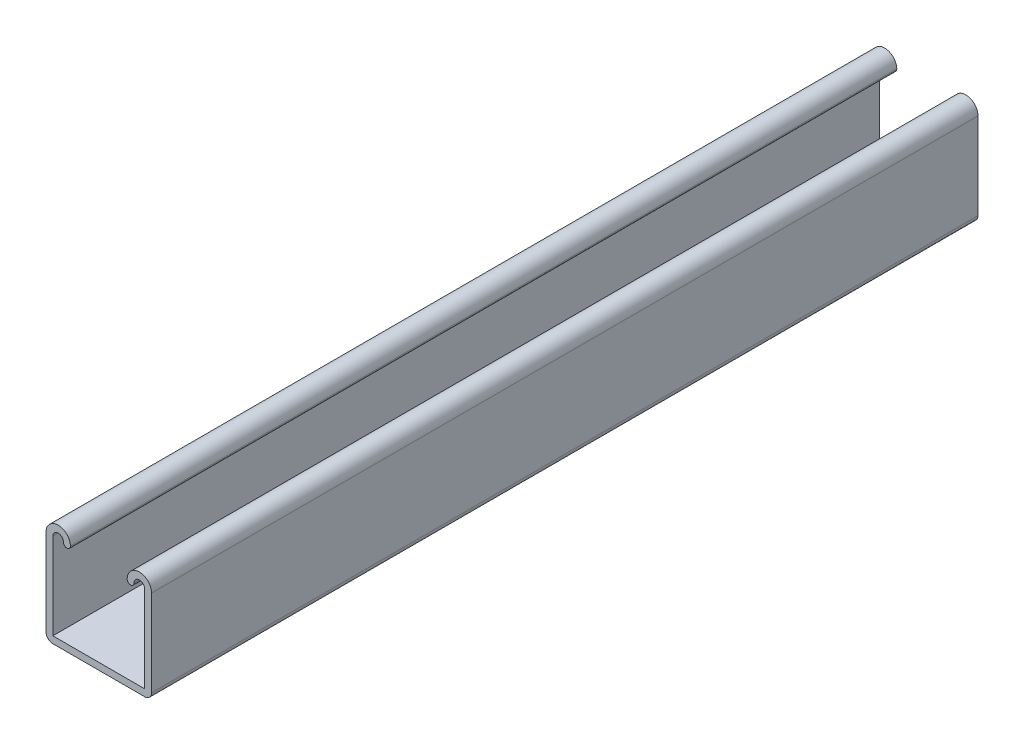
ISO-10303-21;
HEADER;
FILE_DESCRIPTION(('STEP AP214'),'2;1');
FILE_NAME('part.step','',(''),(''),'','','');
FILE_SCHEMA(('AUTOMOTIVE_DESIGN { 1 0 10303 214 1 1 1 1 }'));
ENDSEC;
DATA;
#1=APPLICATION_CONTEXT('core data for automotive mechanical design processes');
#2=APPLICATION_PROTOCOL_DEFINITION('international standard','automotive_design',2000,#1);
#3=PRODUCT_CONTEXT('',#1,'mechanical');
#4=PRODUCT('Part','Part','',(#3));
#5=PRODUCT_RELATED_PRODUCT_CATEGORY('part','',(#4));
#6=PRODUCT_DEFINITION_FORMATION('','',#4);
#7=PRODUCT_DEFINITION_CONTEXT('part definition',#1,'design');
#8=PRODUCT_DEFINITION('design','',#6,#7);
#9=PRODUCT_DEFINITION_SHAPE('','',#8);
#10=(LENGTH_UNIT() NAMED_UNIT(*) SI_UNIT(.MILLI.,.METRE.));
#11=(NAMED_UNIT(*) PLANE_ANGLE_UNIT() SI_UNIT($,.RADIAN.));
#12=(NAMED_UNIT(*) SI_UNIT($,.STERADIAN.) SOLID_ANGLE_UNIT());
#13=UNCERTAINTY_MEASURE_WITH_UNIT(LENGTH_MEASURE(1.E-05),#10,'distance_accuracy_value','');
#14=(GEOMETRIC_REPRESENTATION_CONTEXT(3) GLOBAL_UNCERTAINTY_ASSIGNED_CONTEXT((#13)) GLOBAL_UNIT_ASSIGNED_CONTEXT((#10,
#11,#12)) REPRESENTATION_CONTEXT('',''));
#15=CARTESIAN_POINT('',(0.,0.,0.));
#16=DIRECTION('',(0.,0.,1.));
#17=DIRECTION('',(1.,0.,0.));
#18=AXIS2_PLACEMENT_3D('',#15,#16,#17);
#19=CARTESIAN_POINT('',(0.,2.6924,323.85));
#20=DIRECTION('',(0.,0.,-1.));
#21=DIRECTION('',(-1.,0.,0.));
#22=AXIS2_PLACEMENT_3D('',#19,#20,#21);
#23=CYLINDRICAL_SURFACE('',#22,2.6924);
#24=CARTESIAN_POINT('',(0.,2.6924,0.));
#25=DIRECTION('',(0.,0.,1.));
#26=DIRECTION('',(-1.,0.,0.));
#27=AXIS2_PLACEMENT_3D('',#24,#25,#26);
#28=CIRCLE('',#27,2.6924);
#29=CARTESIAN_POINT('',(-2.6924,2.6924,0.));
#30=VERTEX_POINT('',#29);
#31=CARTESIAN_POINT('',(0.,0.,0.));
#32=VERTEX_POINT('',#31);
#33=EDGE_CURVE('E166',#30,#32,#28,.T.);
#34=ORIENTED_EDGE('',*,*,#33,.T.);
#35=DIRECTION('',(0.,0.,-1.));
#36=VECTOR('',#35,1.);
#37=CARTESIAN_POINT('',(0.,0.,323.85));
#38=LINE('',#37,#36);
#39=CARTESIAN_POINT('',(0.,0.,323.85));
#40=VERTEX_POINT('',#39);
#41=EDGE_CURVE('E11',#40,#32,#38,.T.);
#42=ORIENTED_EDGE('',*,*,#41,.F.);
#43=CARTESIAN_POINT('',(0.,2.6924,323.85));
#44=DIRECTION('',(0.,0.,1.));
#45=DIRECTION('',(-1.,0.,0.));
#46=AXIS2_PLACEMENT_3D('',#43,#44,#45);
#47=CIRCLE('',#46,2.6924);
#48=CARTESIAN_POINT('',(-2.6924,2.6924,323.85));
#49=VERTEX_POINT('',#48);
#50=EDGE_CURVE('E193',#49,#40,#47,.T.);
#51=ORIENTED_EDGE('',*,*,#50,.F.);
#52=DIRECTION('',(0.,0.,-1.));
#53=VECTOR('',#52,1.);
#54=CARTESIAN_POINT('',(-2.6924,2.6924,323.85));
#55=LINE('',#54,#53);
#56=EDGE_CURVE('E162',#49,#30,#55,.T.);
#57=ORIENTED_EDGE('',*,*,#56,.T.);
#58=EDGE_LOOP('',(#34,#42,#51,#57));
#59=FACE_BOUND('',#58,.T.);
#60=ADVANCED_FACE('F32',(#59),#23,.T.);
#61=CARTESIAN_POINT('',(0.,0.,323.85));
#62=DIRECTION('',(0.,1.,0.));
#63=DIRECTION('',(0.,0.,1.));
#64=AXIS2_PLACEMENT_3D('',#61,#62,#63);
#65=PLANE('',#64);
#66=CARTESIAN_POINT('',(17.99,0.,247.65));
#67=DIRECTION('',(0.,-1.,0.));
#68=DIRECTION('',(0.,0.,1.));
#69=AXIS2_PLACEMENT_3D('',#66,#67,#68);
#70=CIRCLE('',#69,7.11200000000001);
#71=CARTESIAN_POINT('',(17.99,0.,254.762));
#72=VERTEX_POINT('',#71);
#73=EDGE_CURVE('E241',#72,#72,#70,.T.);
#74=ORIENTED_EDGE('',*,*,#73,.F.);
#75=EDGE_LOOP('',(#74));
#76=FACE_BOUND('',#75,.T.);
#77=CARTESIAN_POINT('',(17.99,0.,295.402));
#78=DIRECTION('',(0.,-1.,0.));
#79=DIRECTION('',(0.,0.,1.));
#80=AXIS2_PLACEMENT_3D('',#77,#78,#79);
#81=CIRCLE('',#80,7.11199999999999);
#82=CARTESIAN_POINT('',(17.99,0.,302.514));
#83=VERTEX_POINT('',#82);
#84=EDGE_CURVE('E231',#83,#83,#81,.T.);
#85=ORIENTED_EDGE('',*,*,#84,.F.);
#86=EDGE_LOOP('',(#85));
#87=FACE_BOUND('',#86,.T.);
#88=CARTESIAN_POINT('',(17.99,0.,76.2));
#89=DIRECTION('',(0.,-1.,0.));
#90=DIRECTION('',(0.,0.,-1.));
#91=AXIS2_PLACEMENT_3D('',#88,#89,#90);
#92=CIRCLE('',#91,7.112);
#93=CARTESIAN_POINT('',(17.99,0.,69.088));
#94=VERTEX_POINT('',#93);
#95=EDGE_CURVE('E228',#94,#94,#92,.T.);
#96=ORIENTED_EDGE('',*,*,#95,.F.);
#97=EDGE_LOOP('',(#96));
#98=FACE_BOUND('',#97,.T.);
#99=CARTESIAN_POINT('',(17.99,0.,28.448));
#100=DIRECTION('',(0.,-1.,0.));
#101=DIRECTION('',(0.,0.,-1.));
#102=AXIS2_PLACEMENT_3D('',#99,#100,#101);
#103=CIRCLE('',#102,7.112);
#104=CARTESIAN_POINT('',(17.99,0.,21.336));
#105=VERTEX_POINT('',#104);
#106=EDGE_CURVE('E225',#105,#105,#103,.T.);
#107=ORIENTED_EDGE('',*,*,#106,.F.);
#108=EDGE_LOOP('',(#107));
#109=FACE_BOUND('',#108,.T.);
#110=DIRECTION('',(1.,0.,0.));
#111=VECTOR('',#110,1.);
#112=CARTESIAN_POINT('',(0.,0.,0.));
#113=LINE('',#112,#111);
#114=CARTESIAN_POINT('',(35.98,0.,0.));
#115=VERTEX_POINT('',#114);
#116=EDGE_CURVE('E169',#32,#115,#113,.T.);
#117=ORIENTED_EDGE('',*,*,#116,.T.);
#118=DIRECTION('',(0.,0.,-1.));
#119=VECTOR('',#118,1.);
#120=CARTESIAN_POINT('',(35.98,0.,323.85));
#121=LINE('',#120,#119);
#122=CARTESIAN_POINT('',(35.98,0.,323.85));
#123=VERTEX_POINT('',#122);
#124=EDGE_CURVE('E41',#123,#115,#121,.T.);
#125=ORIENTED_EDGE('',*,*,#124,.F.);
#126=DIRECTION('',(1.,0.,0.));
#127=VECTOR('',#126,1.);
#128=CARTESIAN_POINT('',(0.,0.,323.85));
#129=LINE('',#128,#127);
#130=EDGE_CURVE('E111',#40,#123,#129,.T.);
#131=ORIENTED_EDGE('',*,*,#130,.F.);
#132=ORIENTED_EDGE('',*,*,#41,.T.);
#133=EDGE_LOOP('',(#117,#125,#131,#132));
#134=FACE_BOUND('',#133,.T.);
#135=ADVANCED_FACE('F291',(#76,#87,#98,#109,#134),#65,.F.);
#136=CARTESIAN_POINT('',(35.98,2.6924,323.85));
#137=DIRECTION('',(0.,0.,-1.));
#138=DIRECTION('',(-1.,0.,0.));
#139=AXIS2_PLACEMENT_3D('',#136,#137,#138);
#140=CYLINDRICAL_SURFACE('',#139,2.6924);
#141=CARTESIAN_POINT('',(35.98,2.6924,0.));
#142=DIRECTION('',(0.,0.,1.));
#143=DIRECTION('',(1.,0.,0.));
#144=AXIS2_PLACEMENT_3D('',#141,#142,#143);
#145=CIRCLE('',#144,2.6924);
#146=CARTESIAN_POINT('',(38.6724,2.6924,0.));
#147=VERTEX_POINT('',#146);
#148=EDGE_CURVE('E172',#115,#147,#145,.T.);
#149=ORIENTED_EDGE('',*,*,#148,.T.);
#150=DIRECTION('',(0.,0.,-1.));
#151=VECTOR('',#150,1.);
#152=CARTESIAN_POINT('',(38.6724,2.6924,323.85));
#153=LINE('',#152,#151);
#154=CARTESIAN_POINT('',(38.6724,2.6924,323.85));
#155=VERTEX_POINT('',#154);
#156=EDGE_CURVE('E218',#155,#147,#153,.T.);
#157=ORIENTED_EDGE('',*,*,#156,.F.);
#158=CARTESIAN_POINT('',(35.98,2.6924,323.85));
#159=DIRECTION('',(0.,0.,1.));
#160=DIRECTION('',(1.,0.,0.));
#161=AXIS2_PLACEMENT_3D('',#158,#159,#160);
#162=CIRCLE('',#161,2.6924);
#163=EDGE_CURVE('E248',#123,#155,#162,.T.);
#164=ORIENTED_EDGE('',*,*,#163,.F.);
#165=ORIENTED_EDGE('',*,*,#124,.T.);
#166=EDGE_LOOP('',(#149,#157,#164,#165));
#167=FACE_BOUND('',#166,.T.);
#168=ADVANCED_FACE('F295',(#167),#140,.T.);
#169=CARTESIAN_POINT('',(38.6724,2.6924,323.85));
#170=DIRECTION('',(-1.,0.,0.));
#171=DIRECTION('',(0.,0.,1.));
#172=AXIS2_PLACEMENT_3D('',#169,#170,#171);
#173=PLANE('',#172);
#174=DIRECTION('',(0.,1.,0.));
#175=VECTOR('',#174,1.);
#176=CARTESIAN_POINT('',(38.6724,2.6924,0.));
#177=LINE('',#176,#175);
#178=CARTESIAN_POINT('',(38.6724,36.5252,0.));
#179=VERTEX_POINT('',#178);
#180=EDGE_CURVE('E174',#147,#179,#177,.T.);
#181=ORIENTED_EDGE('',*,*,#180,.T.);
#182=DIRECTION('',(0.,0.,-1.));
#183=VECTOR('',#182,1.);
#184=CARTESIAN_POINT('',(38.6724,36.5252,323.85));
#185=LINE('',#184,#183);
#186=CARTESIAN_POINT('',(38.6724,36.5252,323.85));
#187=VERTEX_POINT('',#186);
#188=EDGE_CURVE('E215',#187,#179,#185,.T.);
#189=ORIENTED_EDGE('',*,*,#188,.F.);
#190=DIRECTION('',(0.,1.,0.));
#191=VECTOR('',#190,1.);
#192=CARTESIAN_POINT('',(38.6724,2.6924,323.85));
#193=LINE('',#192,#191);
#194=EDGE_CURVE('E250',#155,#187,#193,.T.);
#195=ORIENTED_EDGE('',*,*,#194,.F.);
#196=ORIENTED_EDGE('',*,*,#156,.T.);
#197=EDGE_LOOP('',(#181,#189,#195,#196));
#198=FACE_BOUND('',#197,.T.);
#199=ADVANCED_FACE('F300',(#198),#173,.F.);
#200=CARTESIAN_POINT('',(33.8972,36.5252,323.85));
#201=DIRECTION('',(0.,0.,-1.));
#202=DIRECTION('',(-1.,0.,0.));
#203=AXIS2_PLACEMENT_3D('',#200,#201,#202);
#204=CYLINDRICAL_SURFACE('',#203,4.7752);
#205=CARTESIAN_POINT('',(33.8972,36.5252,0.));
#206=DIRECTION('',(0.,0.,1.));
#207=DIRECTION('',(1.,0.,0.));
#208=AXIS2_PLACEMENT_3D('',#205,#206,#207);
#209=CIRCLE('',#208,4.7752);
#210=CARTESIAN_POINT('',(29.122,36.5252,0.));
#211=VERTEX_POINT('',#210);
#212=EDGE_CURVE('E176',#179,#211,#209,.T.);
#213=ORIENTED_EDGE('',*,*,#212,.T.);
#214=DIRECTION('',(0.,0.,-1.));
#215=VECTOR('',#214,1.);
#216=CARTESIAN_POINT('',(29.122,36.5252,323.85));
#217=LINE('',#216,#215);
#218=CARTESIAN_POINT('',(29.122,36.5252,323.85));
#219=VERTEX_POINT('',#218);
#220=EDGE_CURVE('E212',#219,#211,#217,.T.);
#221=ORIENTED_EDGE('',*,*,#220,.F.);
#222=CARTESIAN_POINT('',(33.8972,36.5252,323.85));
#223=DIRECTION('',(0.,0.,1.));
#224=DIRECTION('',(1.,0.,0.));
#225=AXIS2_PLACEMENT_3D('',#222,#223,#224);
#226=CIRCLE('',#225,4.7752);
#227=EDGE_CURVE('E252',#187,#219,#226,.T.);
#228=ORIENTED_EDGE('',*,*,#227,.F.);
#229=ORIENTED_EDGE('',*,*,#188,.T.);
#230=EDGE_LOOP('',(#213,#221,#228,#229));
#231=FACE_BOUND('',#230,.T.);
#232=ADVANCED_FACE('F308',(#231),#204,.T.);
#233=CARTESIAN_POINT('',(30.4682,36.5252,323.85));
#234=DIRECTION('',(0.,0.,-1.));
#235=DIRECTION('',(-1.,0.,0.));
#236=AXIS2_PLACEMENT_3D('',#233,#234,#235);
#237=CYLINDRICAL_SURFACE('',#236,1.3462);
#238=CARTESIAN_POINT('',(30.4682,36.5252,0.));
#239=DIRECTION('',(0.,0.,1.));
#240=DIRECTION('',(1.,0.,0.));
#241=AXIS2_PLACEMENT_3D('',#238,#239,#240);
#242=CIRCLE('',#241,1.3462);
#243=CARTESIAN_POINT('',(31.8144,36.5252,0.));
#244=VERTEX_POINT('',#243);
#245=EDGE_CURVE('E178',#211,#244,#242,.T.);
#246=ORIENTED_EDGE('',*,*,#245,.T.);
#247=DIRECTION('',(0.,0.,-1.));
#248=VECTOR('',#247,1.);
#249=CARTESIAN_POINT('',(31.8144,36.5252,323.85));
#250=LINE('',#249,#248);
#251=CARTESIAN_POINT('',(31.8144,36.5252,323.85));
#252=VERTEX_POINT('',#251);
#253=EDGE_CURVE('E209',#252,#244,#250,.T.);
#254=ORIENTED_EDGE('',*,*,#253,.F.);
#255=CARTESIAN_POINT('',(30.4682,36.5252,323.85));
#256=DIRECTION('',(0.,0.,1.));
#257=DIRECTION('',(1.,0.,0.));
#258=AXIS2_PLACEMENT_3D('',#255,#256,#257);
#259=CIRCLE('',#258,1.3462);
#260=EDGE_CURVE('E254',#219,#252,#259,.T.);
#261=ORIENTED_EDGE('',*,*,#260,.F.);
#262=ORIENTED_EDGE('',*,*,#220,.T.);
#263=EDGE_LOOP('',(#246,#254,#261,#262));
#264=FACE_BOUND('',#263,.T.);
#265=ADVANCED_FACE('F312',(#264),#237,.T.);
#266=CARTESIAN_POINT('',(33.8972,36.5252,323.85));
#267=DIRECTION('',(0.,0.,-1.));
#268=DIRECTION('',(-1.,0.,0.));
#269=AXIS2_PLACEMENT_3D('',#266,#267,#268);
#270=CYLINDRICAL_SURFACE('',#269,2.0828);
#271=CARTESIAN_POINT('',(33.8972,36.5252,0.));
#272=DIRECTION('',(0.,0.,-1.));
#273=DIRECTION('',(1.,0.,0.));
#274=AXIS2_PLACEMENT_3D('',#271,#272,#273);
#275=CIRCLE('',#274,2.0828);
#276=CARTESIAN_POINT('',(35.98,36.5252,0.));
#277=VERTEX_POINT('',#276);
#278=EDGE_CURVE('E180',#244,#277,#275,.T.);
#279=ORIENTED_EDGE('',*,*,#278,.T.);
#280=DIRECTION('',(0.,0.,-1.));
#281=VECTOR('',#280,1.);
#282=CARTESIAN_POINT('',(35.98,36.5252,323.85));
#283=LINE('',#282,#281);
#284=CARTESIAN_POINT('',(35.98,36.5252,323.85));
#285=VERTEX_POINT('',#284);
#286=EDGE_CURVE('E206',#285,#277,#283,.T.);
#287=ORIENTED_EDGE('',*,*,#286,.F.);
#288=CARTESIAN_POINT('',(33.8972,36.5252,323.85));
#289=DIRECTION('',(0.,0.,-1.));
#290=DIRECTION('',(1.,0.,0.));
#291=AXIS2_PLACEMENT_3D('',#288,#289,#290);
#292=CIRCLE('',#291,2.0828);
#293=EDGE_CURVE('E256',#252,#285,#292,.T.);
#294=ORIENTED_EDGE('',*,*,#293,.F.);
#295=ORIENTED_EDGE('',*,*,#253,.T.);
#296=EDGE_LOOP('',(#279,#287,#294,#295));
#297=FACE_BOUND('',#296,.T.);
#298=ADVANCED_FACE('F316',(#297),#270,.F.);
#299=CARTESIAN_POINT('',(35.98,2.6924,323.85));
#300=DIRECTION('',(1.,0.,0.));
#301=DIRECTION('',(0.,0.,-1.));
#302=AXIS2_PLACEMENT_3D('',#299,#300,#301);
#303=PLANE('',#302);
#304=DIRECTION('',(0.,-1.,0.));
#305=VECTOR('',#304,1.);
#306=CARTESIAN_POINT('',(35.98,2.6924,0.));
#307=LINE('',#306,#305);
#308=CARTESIAN_POINT('',(35.98,2.6924,0.));
#309=VERTEX_POINT('',#308);
#310=EDGE_CURVE('E182',#277,#309,#307,.T.);
#311=ORIENTED_EDGE('',*,*,#310,.T.);
#312=DIRECTION('',(0.,0.,-1.));
#313=VECTOR('',#312,1.);
#314=CARTESIAN_POINT('',(35.98,2.6924,323.85));
#315=LINE('',#314,#313);
#316=CARTESIAN_POINT('',(35.98,2.6924,323.85));
#317=VERTEX_POINT('',#316);
#318=EDGE_CURVE('E203',#317,#309,#315,.T.);
#319=ORIENTED_EDGE('',*,*,#318,.F.);
#320=DIRECTION('',(0.,-1.,0.));
#321=VECTOR('',#320,1.);
#322=CARTESIAN_POINT('',(35.98,2.6924,323.85));
#323=LINE('',#322,#321);
#324=EDGE_CURVE('E258',#285,#317,#323,.T.);
#325=ORIENTED_EDGE('',*,*,#324,.F.);
#326=ORIENTED_EDGE('',*,*,#286,.T.);
#327=EDGE_LOOP('',(#311,#319,#325,#326));
#328=FACE_BOUND('',#327,.T.);
#329=ADVANCED_FACE('F320',(#328),#303,.F.);
#330=CARTESIAN_POINT('',(35.98,2.6924,323.85));
#331=DIRECTION('',(0.,-1.,0.));
#332=DIRECTION('',(0.,0.,-1.));
#333=AXIS2_PLACEMENT_3D('',#330,#331,#332);
#334=PLANE('',#333);
#335=CARTESIAN_POINT('',(17.99,2.6924,247.65));
#336=DIRECTION('',(0.,-1.,0.));
#337=DIRECTION('',(0.,0.,-1.));
#338=AXIS2_PLACEMENT_3D('',#335,#336,#337);
#339=CIRCLE('',#338,7.11200000000001);
#340=CARTESIAN_POINT('',(17.99,2.6924,240.538));
#341=VERTEX_POINT('',#340);
#342=EDGE_CURVE('E35',#341,#341,#339,.T.);
#343=ORIENTED_EDGE('',*,*,#342,.T.);
#344=EDGE_LOOP('',(#343));
#345=FACE_BOUND('',#344,.T.);
#346=CARTESIAN_POINT('',(17.99,2.6924,295.402));
#347=DIRECTION('',(0.,-1.,0.));
#348=DIRECTION('',(0.,0.,-1.));
#349=AXIS2_PLACEMENT_3D('',#346,#347,#348);
#350=CIRCLE('',#349,7.11199999999999);
#351=CARTESIAN_POINT('',(17.99,2.6924,288.29));
#352=VERTEX_POINT('',#351);
#353=EDGE_CURVE('E229',#352,#352,#350,.T.);
#354=ORIENTED_EDGE('',*,*,#353,.T.);
#355=EDGE_LOOP('',(#354));
#356=FACE_BOUND('',#355,.T.);
#357=CARTESIAN_POINT('',(17.99,2.6924,76.2));
#358=DIRECTION('',(0.,-1.,0.));
#359=DIRECTION('',(0.,0.,-1.));
#360=AXIS2_PLACEMENT_3D('',#357,#358,#359);
#361=CIRCLE('',#360,7.112);
#362=CARTESIAN_POINT('',(17.99,2.6924,69.088));
#363=VERTEX_POINT('',#362);
#364=EDGE_CURVE('E226',#363,#363,#361,.T.);
#365=ORIENTED_EDGE('',*,*,#364,.T.);
#366=EDGE_LOOP('',(#365));
#367=FACE_BOUND('',#366,.T.);
#368=CARTESIAN_POINT('',(17.99,2.6924,28.448));
#369=DIRECTION('',(0.,-1.,0.));
#370=DIRECTION('',(0.,0.,-1.));
#371=AXIS2_PLACEMENT_3D('',#368,#369,#370);
#372=CIRCLE('',#371,7.112);
#373=CARTESIAN_POINT('',(17.99,2.6924,21.336));
#374=VERTEX_POINT('',#373);
#375=EDGE_CURVE('E170',#374,#374,#372,.T.);
#376=ORIENTED_EDGE('',*,*,#375,.T.);
#377=EDGE_LOOP('',(#376));
#378=FACE_BOUND('',#377,.T.);
#379=DIRECTION('',(-1.,0.,0.));
#380=VECTOR('',#379,1.);
#381=CARTESIAN_POINT('',(35.98,2.6924,0.));
#382=LINE('',#381,#380);
#383=CARTESIAN_POINT('',(0.,2.6924,0.));
#384=VERTEX_POINT('',#383);
#385=EDGE_CURVE('E184',#309,#384,#382,.T.);
#386=ORIENTED_EDGE('',*,*,#385,.T.);
#387=DIRECTION('',(0.,0.,-1.));
#388=VECTOR('',#387,1.);
#389=CARTESIAN_POINT('',(0.,2.6924,323.85));
#390=LINE('',#389,#388);
#391=CARTESIAN_POINT('',(0.,2.6924,323.85));
#392=VERTEX_POINT('',#391);
#393=EDGE_CURVE('E200',#392,#384,#390,.T.);
#394=ORIENTED_EDGE('',*,*,#393,.F.);
#395=DIRECTION('',(-1.,0.,0.));
#396=VECTOR('',#395,1.);
#397=CARTESIAN_POINT('',(35.98,2.6924,323.85));
#398=LINE('',#397,#396);
#399=EDGE_CURVE('E260',#317,#392,#398,.T.);
#400=ORIENTED_EDGE('',*,*,#399,.F.);
#401=ORIENTED_EDGE('',*,*,#318,.T.);
#402=EDGE_LOOP('',(#386,#394,#400,#401));
#403=FACE_BOUND('',#402,.T.);
#404=ADVANCED_FACE('F324',(#345,#356,#367,#378,#403),#334,.F.);
#405=CARTESIAN_POINT('',(0.,2.6924,323.85));
#406=DIRECTION('',(-1.,0.,0.));
#407=DIRECTION('',(0.,0.,1.));
#408=AXIS2_PLACEMENT_3D('',#405,#406,#407);
#409=PLANE('',#408);
#410=DIRECTION('',(0.,1.,0.));
#411=VECTOR('',#410,1.);
#412=CARTESIAN_POINT('',(0.,2.6924,0.));
#413=LINE('',#412,#411);
#414=CARTESIAN_POINT('',(0.,36.5252,0.));
#415=VERTEX_POINT('',#414);
#416=EDGE_CURVE('E186',#384,#415,#413,.T.);
#417=ORIENTED_EDGE('',*,*,#416,.T.);
#418=DIRECTION('',(0.,0.,-1.));
#419=VECTOR('',#418,1.);
#420=CARTESIAN_POINT('',(0.,36.5252,323.85));
#421=LINE('',#420,#419);
#422=CARTESIAN_POINT('',(0.,36.5252,323.85));
#423=VERTEX_POINT('',#422);
#424=EDGE_CURVE('E197',#423,#415,#421,.T.);
#425=ORIENTED_EDGE('',*,*,#424,.F.);
#426=DIRECTION('',(0.,1.,0.));
#427=VECTOR('',#426,1.);
#428=CARTESIAN_POINT('',(0.,2.6924,323.85));
#429=LINE('',#428,#427);
#430=EDGE_CURVE('E262',#392,#423,#429,.T.);
#431=ORIENTED_EDGE('',*,*,#430,.F.);
#432=ORIENTED_EDGE('',*,*,#393,.T.);
#433=EDGE_LOOP('',(#417,#425,#431,#432));
#434=FACE_BOUND('',#433,.T.);
#435=ADVANCED_FACE('F268',(#434),#409,.F.);
#436=CARTESIAN_POINT('',(2.0828,36.5252,323.85));
#437=DIRECTION('',(0.,0.,-1.));
#438=DIRECTION('',(-1.,0.,0.));
#439=AXIS2_PLACEMENT_3D('',#436,#437,#438);
#440=CYLINDRICAL_SURFACE('',#439,2.0828);
#441=CARTESIAN_POINT('',(2.0828,36.5252,0.));
#442=DIRECTION('',(0.,0.,-1.));
#443=DIRECTION('',(-1.,0.,0.));
#444=AXIS2_PLACEMENT_3D('',#441,#442,#443);
#445=CIRCLE('',#444,2.0828);
#446=CARTESIAN_POINT('',(4.16560000000001,36.5252,0.));
#447=VERTEX_POINT('',#446);
#448=EDGE_CURVE('E188',#415,#447,#445,.T.);
#449=ORIENTED_EDGE('',*,*,#448,.T.);
#450=DIRECTION('',(0.,0.,-1.));
#451=VECTOR('',#450,1.);
#452=CARTESIAN_POINT('',(4.16560000000001,36.5252,323.85));
#453=LINE('',#452,#451);
#454=CARTESIAN_POINT('',(4.16560000000001,36.5252,323.85));
#455=VERTEX_POINT('',#454);
#456=EDGE_CURVE('E157',#455,#447,#453,.T.);
#457=ORIENTED_EDGE('',*,*,#456,.F.);
#458=CARTESIAN_POINT('',(2.0828,36.5252,323.85));
#459=DIRECTION('',(0.,0.,-1.));
#460=DIRECTION('',(-1.,0.,0.));
#461=AXIS2_PLACEMENT_3D('',#458,#459,#460);
#462=CIRCLE('',#461,2.0828);
#463=EDGE_CURVE('E148',#423,#455,#462,.T.);
#464=ORIENTED_EDGE('',*,*,#463,.F.);
#465=ORIENTED_EDGE('',*,*,#424,.T.);
#466=EDGE_LOOP('',(#449,#457,#464,#465));
#467=FACE_BOUND('',#466,.T.);
#468=ADVANCED_FACE('F272',(#467),#440,.F.);
#469=CARTESIAN_POINT('',(5.5118,36.5252,323.85));
#470=DIRECTION('',(0.,0.,-1.));
#471=DIRECTION('',(-1.,0.,0.));
#472=AXIS2_PLACEMENT_3D('',#469,#470,#471);
#473=CYLINDRICAL_SURFACE('',#472,1.3462);
#474=CARTESIAN_POINT('',(5.5118,36.5252,0.));
#475=DIRECTION('',(0.,0.,1.));
#476=DIRECTION('',(-1.,0.,0.));
#477=AXIS2_PLACEMENT_3D('',#474,#475,#476);
#478=CIRCLE('',#477,1.3462);
#479=CARTESIAN_POINT('',(6.858,36.5252,0.));
#480=VERTEX_POINT('',#479);
#481=EDGE_CURVE('E156',#447,#480,#478,.T.);
#482=ORIENTED_EDGE('',*,*,#481,.T.);
#483=DIRECTION('',(0.,0.,-1.));
#484=VECTOR('',#483,1.);
#485=CARTESIAN_POINT('',(6.858,36.5252,323.85));
#486=LINE('',#485,#484);
#487=CARTESIAN_POINT('',(6.858,36.5252,323.85));
#488=VERTEX_POINT('',#487);
#489=EDGE_CURVE('E153',#488,#480,#486,.T.);
#490=ORIENTED_EDGE('',*,*,#489,.F.);
#491=CARTESIAN_POINT('',(5.5118,36.5252,323.85));
#492=DIRECTION('',(0.,0.,1.));
#493=DIRECTION('',(-1.,0.,0.));
#494=AXIS2_PLACEMENT_3D('',#491,#492,#493);
#495=CIRCLE('',#494,1.3462);
#496=EDGE_CURVE('E142',#455,#488,#495,.T.);
#497=ORIENTED_EDGE('',*,*,#496,.F.);
#498=ORIENTED_EDGE('',*,*,#456,.T.);
#499=EDGE_LOOP('',(#482,#490,#497,#498));
#500=FACE_BOUND('',#499,.T.);
#501=ADVANCED_FACE('F154',(#500),#473,.T.);
#502=CARTESIAN_POINT('',(2.0828,36.5252,323.85));
#503=DIRECTION('',(0.,0.,-1.));
#504=DIRECTION('',(-1.,0.,0.));
#505=AXIS2_PLACEMENT_3D('',#502,#503,#504);
#506=CYLINDRICAL_SURFACE('',#505,4.7752);
#507=CARTESIAN_POINT('',(2.0828,36.5252,0.));
#508=DIRECTION('',(0.,0.,1.));
#509=DIRECTION('',(-1.,0.,0.));
#510=AXIS2_PLACEMENT_3D('',#507,#508,#509);
#511=CIRCLE('',#510,4.7752);
#512=CARTESIAN_POINT('',(-2.6924,36.5252,0.));
#513=VERTEX_POINT('',#512);
#514=EDGE_CURVE('E97',#480,#513,#511,.T.);
#515=ORIENTED_EDGE('',*,*,#514,.T.);
#516=DIRECTION('',(0.,0.,-1.));
#517=VECTOR('',#516,1.);
#518=CARTESIAN_POINT('',(-2.6924,36.5252,323.85));
#519=LINE('',#518,#517);
#520=CARTESIAN_POINT('',(-2.6924,36.5252,323.85));
#521=VERTEX_POINT('',#520);
#522=EDGE_CURVE('E158',#521,#513,#519,.T.);
#523=ORIENTED_EDGE('',*,*,#522,.F.);
#524=CARTESIAN_POINT('',(2.0828,36.5252,323.85));
#525=DIRECTION('',(0.,0.,1.));
#526=DIRECTION('',(-1.,0.,0.));
#527=AXIS2_PLACEMENT_3D('',#524,#525,#526);
#528=CIRCLE('',#527,4.7752);
#529=EDGE_CURVE('E146',#488,#521,#528,.T.);
#530=ORIENTED_EDGE('',*,*,#529,.F.);
#531=ORIENTED_EDGE('',*,*,#489,.T.);
#532=EDGE_LOOP('',(#515,#523,#530,#531));
#533=FACE_BOUND('',#532,.T.);
#534=ADVANCED_FACE('F160',(#533),#506,.T.);
#535=CARTESIAN_POINT('',(-2.6924,2.6924,323.85));
#536=DIRECTION('',(1.,0.,0.));
#537=DIRECTION('',(0.,0.,-1.));
#538=AXIS2_PLACEMENT_3D('',#535,#536,#537);
#539=PLANE('',#538);
#540=DIRECTION('',(0.,-1.,0.));
#541=VECTOR('',#540,1.);
#542=CARTESIAN_POINT('',(-2.6924,2.6924,0.));
#543=LINE('',#542,#541);
#544=EDGE_CURVE('E103',#513,#30,#543,.T.);
#545=ORIENTED_EDGE('',*,*,#544,.T.);
#546=ORIENTED_EDGE('',*,*,#56,.F.);
#547=DIRECTION('',(0.,-1.,0.));
#548=VECTOR('',#547,1.);
#549=CARTESIAN_POINT('',(-2.6924,2.6924,323.85));
#550=LINE('',#549,#548);
#551=EDGE_CURVE('E50',#521,#49,#550,.T.);
#552=ORIENTED_EDGE('',*,*,#551,.F.);
#553=ORIENTED_EDGE('',*,*,#522,.T.);
#554=EDGE_LOOP('',(#545,#546,#552,#553));
#555=FACE_BOUND('',#554,.T.);
#556=ADVANCED_FACE('F280',(#555),#539,.F.);
#557=CARTESIAN_POINT('',(0.,2.6924,323.85));
#558=DIRECTION('',(0.,0.,-1.));
#559=DIRECTION('',(-1.,0.,0.));
#560=AXIS2_PLACEMENT_3D('',#557,#558,#559);
#561=PLANE('',#560);
#562=ORIENTED_EDGE('',*,*,#50,.T.);
#563=ORIENTED_EDGE('',*,*,#130,.T.);
#564=ORIENTED_EDGE('',*,*,#163,.T.);
#565=ORIENTED_EDGE('',*,*,#194,.T.);
#566=ORIENTED_EDGE('',*,*,#227,.T.);
#567=ORIENTED_EDGE('',*,*,#260,.T.);
#568=ORIENTED_EDGE('',*,*,#293,.T.);
#569=ORIENTED_EDGE('',*,*,#324,.T.);
#570=ORIENTED_EDGE('',*,*,#399,.T.);
#571=ORIENTED_EDGE('',*,*,#430,.T.);
#572=ORIENTED_EDGE('',*,*,#463,.T.);
#573=ORIENTED_EDGE('',*,*,#496,.T.);
#574=ORIENTED_EDGE('',*,*,#529,.T.);
#575=ORIENTED_EDGE('',*,*,#551,.T.);
#576=EDGE_LOOP('',(#562,#563,#564,#565,#566,#567,#568,#569,#570,#571,#572,#573,#574,#575));
#577=FACE_BOUND('',#576,.T.);
#578=ADVANCED_FACE('F144',(#577),#561,.F.);
#579=CARTESIAN_POINT('',(0.,2.6924,0.));
#580=DIRECTION('',(0.,0.,-1.));
#581=DIRECTION('',(-1.,0.,0.));
#582=AXIS2_PLACEMENT_3D('',#579,#580,#581);
#583=PLANE('',#582);
#584=ORIENTED_EDGE('',*,*,#33,.F.);
#585=ORIENTED_EDGE('',*,*,#544,.F.);
#586=ORIENTED_EDGE('',*,*,#514,.F.);
#587=ORIENTED_EDGE('',*,*,#481,.F.);
#588=ORIENTED_EDGE('',*,*,#448,.F.);
#589=ORIENTED_EDGE('',*,*,#416,.F.);
#590=ORIENTED_EDGE('',*,*,#385,.F.);
#591=ORIENTED_EDGE('',*,*,#310,.F.);
#592=ORIENTED_EDGE('',*,*,#278,.F.);
#593=ORIENTED_EDGE('',*,*,#245,.F.);
#594=ORIENTED_EDGE('',*,*,#212,.F.);
#595=ORIENTED_EDGE('',*,*,#180,.F.);
#596=ORIENTED_EDGE('',*,*,#148,.F.);
#597=ORIENTED_EDGE('',*,*,#116,.F.);
#598=EDGE_LOOP('',(#584,#585,#586,#587,#588,#589,#590,#591,#592,#593,#594,#595,#596,#597));
#599=FACE_BOUND('',#598,.T.);
#600=ADVANCED_FACE('F275',(#599),#583,.T.);
#601=CARTESIAN_POINT('',(17.99,41.3004,28.448));
#602=DIRECTION('',(0.,-1.,0.));
#603=DIRECTION('',(0.,0.,-1.));
#604=AXIS2_PLACEMENT_3D('',#601,#602,#603);
#605=CYLINDRICAL_SURFACE('',#604,7.112);
#606=ORIENTED_EDGE('',*,*,#106,.T.);
#607=EDGE_LOOP('',(#606));
#608=FACE_BOUND('',#607,.T.);
#609=ORIENTED_EDGE('',*,*,#375,.F.);
#610=EDGE_LOOP('',(#609));
#611=FACE_BOUND('',#610,.T.);
#612=ADVANCED_FACE('F360',(#608,#611),#605,.F.);
#613=CARTESIAN_POINT('',(17.99,41.3004,76.2));
#614=DIRECTION('',(0.,-1.,0.));
#615=DIRECTION('',(0.,0.,-1.));
#616=AXIS2_PLACEMENT_3D('',#613,#614,#615);
#617=CYLINDRICAL_SURFACE('',#616,7.112);
#618=ORIENTED_EDGE('',*,*,#95,.T.);
#619=EDGE_LOOP('',(#618));
#620=FACE_BOUND('',#619,.T.);
#621=ORIENTED_EDGE('',*,*,#364,.F.);
#622=EDGE_LOOP('',(#621));
#623=FACE_BOUND('',#622,.T.);
#624=ADVANCED_FACE('F383',(#620,#623),#617,.F.);
#625=CARTESIAN_POINT('',(17.99,41.3004,295.402));
#626=DIRECTION('',(0.,-1.,0.));
#627=DIRECTION('',(0.,0.,-1.));
#628=AXIS2_PLACEMENT_3D('',#625,#626,#627);
#629=CYLINDRICAL_SURFACE('',#628,7.11199999999999);
#630=ORIENTED_EDGE('',*,*,#84,.T.);
#631=EDGE_LOOP('',(#630));
#632=FACE_BOUND('',#631,.T.);
#633=ORIENTED_EDGE('',*,*,#353,.F.);
#634=EDGE_LOOP('',(#633));
#635=FACE_BOUND('',#634,.T.);
#636=ADVANCED_FACE('F393',(#632,#635),#629,.F.);
#637=CARTESIAN_POINT('',(17.99,41.3004,247.65));
#638=DIRECTION('',(0.,-1.,0.));
#639=DIRECTION('',(0.,0.,-1.));
#640=AXIS2_PLACEMENT_3D('',#637,#638,#639);
#641=CYLINDRICAL_SURFACE('',#640,7.11200000000001);
#642=ORIENTED_EDGE('',*,*,#73,.T.);
#643=EDGE_LOOP('',(#642));
#644=FACE_BOUND('',#643,.T.);
#645=ORIENTED_EDGE('',*,*,#342,.F.);
#646=EDGE_LOOP('',(#645));
#647=FACE_BOUND('',#646,.T.);
#648=ADVANCED_FACE('F403',(#644,#647),#641,.F.);
#649=CLOSED_SHELL('',(#60,#135,#168,#199,#232,#265,#298,#329,#404,#435,#468,#501,#534,#556,#578,
#600,#612,#624,#636,#648));
#650=MANIFOLD_SOLID_BREP('B2',#649);
#651=ADVANCED_BREP_SHAPE_REPRESENTATION('',(#18,#650),#14);
#652=SHAPE_DEFINITION_REPRESENTATION(#9,#651);
ENDSEC;
END-ISO-10303-21;
